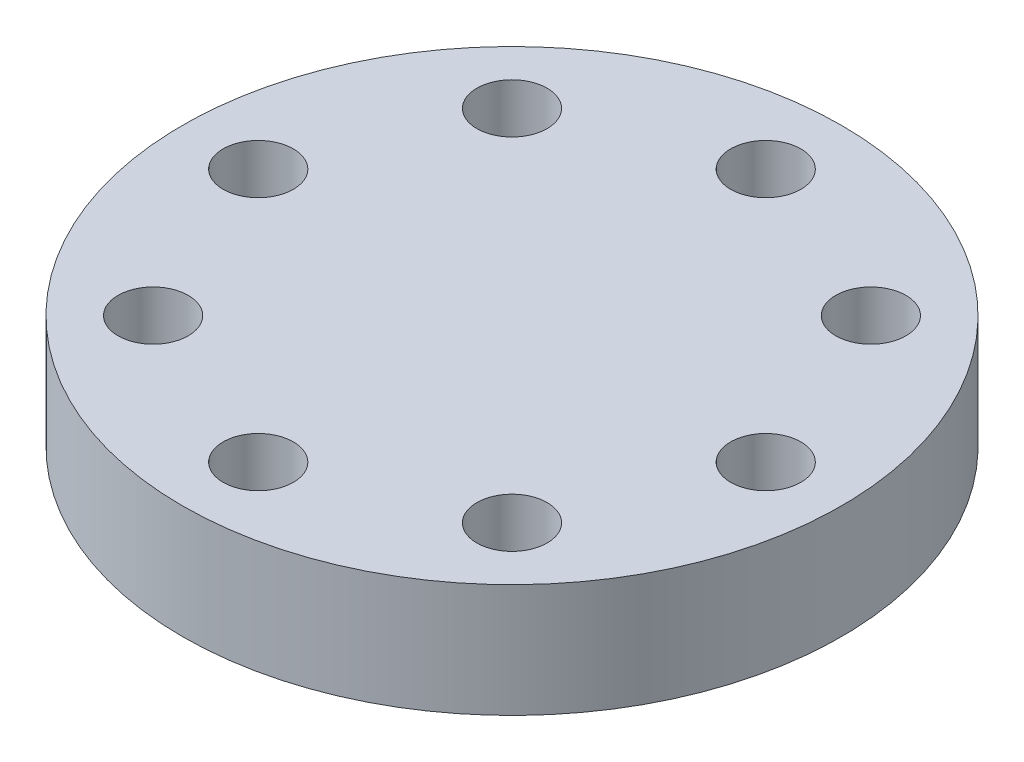
ISO-10303-21;
HEADER;
FILE_DESCRIPTION(('STEP AP214'),'2;1');
FILE_NAME('part.step','',(''),(''),'','','');
FILE_SCHEMA(('AUTOMOTIVE_DESIGN { 1 0 10303 214 1 1 1 1 }'));
ENDSEC;
DATA;
#1=APPLICATION_CONTEXT('core data for automotive mechanical design processes');
#2=APPLICATION_PROTOCOL_DEFINITION('international standard','automotive_design',2000,#1);
#3=PRODUCT_CONTEXT('',#1,'mechanical');
#4=PRODUCT('Part','Part','',(#3));
#5=PRODUCT_RELATED_PRODUCT_CATEGORY('part','',(#4));
#6=PRODUCT_DEFINITION_FORMATION('','',#4);
#7=PRODUCT_DEFINITION_CONTEXT('part definition',#1,'design');
#8=PRODUCT_DEFINITION('design','',#6,#7);
#9=PRODUCT_DEFINITION_SHAPE('','',#8);
#10=(LENGTH_UNIT() NAMED_UNIT(*) SI_UNIT(.MILLI.,.METRE.));
#11=(NAMED_UNIT(*) PLANE_ANGLE_UNIT() SI_UNIT($,.RADIAN.));
#12=(NAMED_UNIT(*) SI_UNIT($,.STERADIAN.) SOLID_ANGLE_UNIT());
#13=UNCERTAINTY_MEASURE_WITH_UNIT(LENGTH_MEASURE(1.E-05),#10,'distance_accuracy_value','');
#14=(GEOMETRIC_REPRESENTATION_CONTEXT(3) GLOBAL_UNCERTAINTY_ASSIGNED_CONTEXT((#13)) GLOBAL_UNIT_ASSIGNED_CONTEXT((#10,
#11,#12)) REPRESENTATION_CONTEXT('',''));
#15=CARTESIAN_POINT('',(0.,0.,0.));
#16=DIRECTION('',(0.,0.,1.));
#17=DIRECTION('',(1.,0.,0.));
#18=AXIS2_PLACEMENT_3D('',#15,#16,#17);
#19=CARTESIAN_POINT('',(0.,4.365625,0.));
#20=DIRECTION('',(0.,-1.,0.));
#21=DIRECTION('',(0.,0.,-1.));
#22=AXIS2_PLACEMENT_3D('',#19,#20,#21);
#23=CYLINDRICAL_SURFACE('',#22,12.7);
#24=CARTESIAN_POINT('',(0.,4.365625,0.));
#25=DIRECTION('',(0.,1.,0.));
#26=DIRECTION('',(0.,0.,1.));
#27=AXIS2_PLACEMENT_3D('',#24,#25,#26);
#28=CIRCLE('',#27,12.7);
#29=CARTESIAN_POINT('',(0.,4.365625,12.7));
#30=VERTEX_POINT('',#29);
#31=EDGE_CURVE('E10',#30,#30,#28,.T.);
#32=ORIENTED_EDGE('',*,*,#31,.F.);
#33=EDGE_LOOP('',(#32));
#34=FACE_BOUND('',#33,.T.);
#35=CARTESIAN_POINT('',(0.,0.,0.));
#36=DIRECTION('',(0.,1.,0.));
#37=DIRECTION('',(0.,0.,1.));
#38=AXIS2_PLACEMENT_3D('',#35,#36,#37);
#39=CIRCLE('',#38,12.7);
#40=CARTESIAN_POINT('',(0.,0.,12.7));
#41=VERTEX_POINT('',#40);
#42=EDGE_CURVE('E41',#41,#41,#39,.T.);
#43=ORIENTED_EDGE('',*,*,#42,.T.);
#44=EDGE_LOOP('',(#43));
#45=FACE_BOUND('',#44,.T.);
#46=ADVANCED_FACE('F34',(#34,#45),#23,.T.);
#47=CARTESIAN_POINT('',(0.,4.365625,0.));
#48=DIRECTION('',(0.,1.,0.));
#49=DIRECTION('',(0.,0.,1.));
#50=AXIS2_PLACEMENT_3D('',#47,#48,#49);
#51=PLANE('',#50);
#52=CARTESIAN_POINT('',(0.,4.365625,-9.779));
#53=DIRECTION('',(0.,1.,0.));
#54=DIRECTION('',(0.,0.,1.));
#55=AXIS2_PLACEMENT_3D('',#52,#53,#54);
#56=CIRCLE('',#55,1.35254999999999);
#57=CARTESIAN_POINT('',(0.,4.365625,-8.42645000000001));
#58=VERTEX_POINT('',#57);
#59=EDGE_CURVE('E85',#58,#58,#56,.T.);
#60=ORIENTED_EDGE('',*,*,#59,.F.);
#61=EDGE_LOOP('',(#60));
#62=FACE_BOUND('',#61,.T.);
#63=CARTESIAN_POINT('',(6.91479721322325,4.365625,-6.91479721322325));
#64=DIRECTION('',(0.,1.,0.));
#65=DIRECTION('',(0.,0.,1.));
#66=AXIS2_PLACEMENT_3D('',#63,#64,#65);
#67=CIRCLE('',#66,1.35254999999999);
#68=CARTESIAN_POINT('',(6.91479721322325,4.365625,-5.56224721322326));
#69=VERTEX_POINT('',#68);
#70=EDGE_CURVE('E75',#69,#69,#67,.T.);
#71=ORIENTED_EDGE('',*,*,#70,.F.);
#72=EDGE_LOOP('',(#71));
#73=FACE_BOUND('',#72,.T.);
#74=CARTESIAN_POINT('',(9.779,4.365625,0.));
#75=DIRECTION('',(0.,1.,0.));
#76=DIRECTION('',(0.,0.,1.));
#77=AXIS2_PLACEMENT_3D('',#74,#75,#76);
#78=CIRCLE('',#77,1.35254999999999);
#79=CARTESIAN_POINT('',(9.779,4.365625,1.35254999999999));
#80=VERTEX_POINT('',#79);
#81=EDGE_CURVE('E72',#80,#80,#78,.T.);
#82=ORIENTED_EDGE('',*,*,#81,.F.);
#83=EDGE_LOOP('',(#82));
#84=FACE_BOUND('',#83,.T.);
#85=CARTESIAN_POINT('',(6.91479721322325,4.365625,6.91479721322325));
#86=DIRECTION('',(0.,1.,0.));
#87=DIRECTION('',(0.,0.,1.));
#88=AXIS2_PLACEMENT_3D('',#85,#86,#87);
#89=CIRCLE('',#88,1.35254999999999);
#90=CARTESIAN_POINT('',(6.91479721322325,4.365625,8.26734721322324));
#91=VERTEX_POINT('',#90);
#92=EDGE_CURVE('E69',#91,#91,#89,.T.);
#93=ORIENTED_EDGE('',*,*,#92,.F.);
#94=EDGE_LOOP('',(#93));
#95=FACE_BOUND('',#94,.T.);
#96=CARTESIAN_POINT('',(0.,4.365625,9.779));
#97=DIRECTION('',(0.,1.,0.));
#98=DIRECTION('',(0.,0.,1.));
#99=AXIS2_PLACEMENT_3D('',#96,#97,#98);
#100=CIRCLE('',#99,1.35254999999999);
#101=CARTESIAN_POINT('',(0.,4.365625,11.13155));
#102=VERTEX_POINT('',#101);
#103=EDGE_CURVE('E65',#102,#102,#100,.T.);
#104=ORIENTED_EDGE('',*,*,#103,.F.);
#105=EDGE_LOOP('',(#104));
#106=FACE_BOUND('',#105,.T.);
#107=CARTESIAN_POINT('',(-6.91479721322325,4.365625,6.91479721322325));
#108=DIRECTION('',(0.,1.,0.));
#109=DIRECTION('',(0.,0.,1.));
#110=AXIS2_PLACEMENT_3D('',#107,#108,#109);
#111=CIRCLE('',#110,1.35254999999999);
#112=CARTESIAN_POINT('',(-6.91479721322325,4.365625,8.26734721322324));
#113=VERTEX_POINT('',#112);
#114=EDGE_CURVE('E61',#113,#113,#111,.T.);
#115=ORIENTED_EDGE('',*,*,#114,.F.);
#116=EDGE_LOOP('',(#115));
#117=FACE_BOUND('',#116,.T.);
#118=CARTESIAN_POINT('',(-9.779,4.365625,0.));
#119=DIRECTION('',(0.,1.,0.));
#120=DIRECTION('',(0.,0.,1.));
#121=AXIS2_PLACEMENT_3D('',#118,#119,#120);
#122=CIRCLE('',#121,1.35254999999999);
#123=CARTESIAN_POINT('',(-9.779,4.365625,1.35254999999999));
#124=VERTEX_POINT('',#123);
#125=EDGE_CURVE('E57',#124,#124,#122,.T.);
#126=ORIENTED_EDGE('',*,*,#125,.F.);
#127=EDGE_LOOP('',(#126));
#128=FACE_BOUND('',#127,.T.);
#129=CARTESIAN_POINT('',(-6.91479721322325,4.365625,-6.91479721322325));
#130=DIRECTION('',(0.,1.,0.));
#131=DIRECTION('',(0.,0.,1.));
#132=AXIS2_PLACEMENT_3D('',#129,#130,#131);
#133=CIRCLE('',#132,1.35254999999999);
#134=CARTESIAN_POINT('',(-6.91479721322325,4.365625,-5.56224721322326));
#135=VERTEX_POINT('',#134);
#136=EDGE_CURVE('E49',#135,#135,#133,.T.);
#137=ORIENTED_EDGE('',*,*,#136,.F.);
#138=EDGE_LOOP('',(#137));
#139=FACE_BOUND('',#138,.T.);
#140=ORIENTED_EDGE('',*,*,#31,.T.);
#141=EDGE_LOOP('',(#140));
#142=FACE_BOUND('',#141,.T.);
#143=ADVANCED_FACE('F99',(#62,#73,#84,#95,#106,#117,#128,#139,#142),#51,.T.);
#144=CARTESIAN_POINT('',(0.,0.,0.));
#145=DIRECTION('',(0.,1.,0.));
#146=DIRECTION('',(0.,0.,1.));
#147=AXIS2_PLACEMENT_3D('',#144,#145,#146);
#148=PLANE('',#147);
#149=CARTESIAN_POINT('',(0.,0.,-9.779));
#150=DIRECTION('',(0.,1.,0.));
#151=DIRECTION('',(0.,0.,1.));
#152=AXIS2_PLACEMENT_3D('',#149,#150,#151);
#153=CIRCLE('',#152,1.35254999999999);
#154=CARTESIAN_POINT('',(0.,0.,-8.42645000000001));
#155=VERTEX_POINT('',#154);
#156=EDGE_CURVE('E37',#155,#155,#153,.T.);
#157=ORIENTED_EDGE('',*,*,#156,.T.);
#158=EDGE_LOOP('',(#157));
#159=FACE_BOUND('',#158,.T.);
#160=CARTESIAN_POINT('',(6.91479721322325,0.,-6.91479721322325));
#161=DIRECTION('',(0.,1.,0.));
#162=DIRECTION('',(0.,0.,1.));
#163=AXIS2_PLACEMENT_3D('',#160,#161,#162);
#164=CIRCLE('',#163,1.35254999999999);
#165=CARTESIAN_POINT('',(6.91479721322325,0.,-5.56224721322326));
#166=VERTEX_POINT('',#165);
#167=EDGE_CURVE('E73',#166,#166,#164,.T.);
#168=ORIENTED_EDGE('',*,*,#167,.T.);
#169=EDGE_LOOP('',(#168));
#170=FACE_BOUND('',#169,.T.);
#171=CARTESIAN_POINT('',(9.779,0.,0.));
#172=DIRECTION('',(0.,1.,0.));
#173=DIRECTION('',(0.,0.,1.));
#174=AXIS2_PLACEMENT_3D('',#171,#172,#173);
#175=CIRCLE('',#174,1.35254999999999);
#176=CARTESIAN_POINT('',(9.779,0.,1.35254999999999));
#177=VERTEX_POINT('',#176);
#178=EDGE_CURVE('E70',#177,#177,#175,.T.);
#179=ORIENTED_EDGE('',*,*,#178,.T.);
#180=EDGE_LOOP('',(#179));
#181=FACE_BOUND('',#180,.T.);
#182=CARTESIAN_POINT('',(6.91479721322325,0.,6.91479721322325));
#183=DIRECTION('',(0.,1.,0.));
#184=DIRECTION('',(0.,0.,1.));
#185=AXIS2_PLACEMENT_3D('',#182,#183,#184);
#186=CIRCLE('',#185,1.35254999999999);
#187=CARTESIAN_POINT('',(6.91479721322325,0.,8.26734721322324));
#188=VERTEX_POINT('',#187);
#189=EDGE_CURVE('E66',#188,#188,#186,.T.);
#190=ORIENTED_EDGE('',*,*,#189,.T.);
#191=EDGE_LOOP('',(#190));
#192=FACE_BOUND('',#191,.T.);
#193=CARTESIAN_POINT('',(0.,0.,9.779));
#194=DIRECTION('',(0.,1.,0.));
#195=DIRECTION('',(0.,0.,1.));
#196=AXIS2_PLACEMENT_3D('',#193,#194,#195);
#197=CIRCLE('',#196,1.35254999999999);
#198=CARTESIAN_POINT('',(0.,0.,11.13155));
#199=VERTEX_POINT('',#198);
#200=EDGE_CURVE('E62',#199,#199,#197,.T.);
#201=ORIENTED_EDGE('',*,*,#200,.T.);
#202=EDGE_LOOP('',(#201));
#203=FACE_BOUND('',#202,.T.);
#204=CARTESIAN_POINT('',(-6.91479721322325,0.,6.91479721322325));
#205=DIRECTION('',(0.,1.,0.));
#206=DIRECTION('',(0.,0.,1.));
#207=AXIS2_PLACEMENT_3D('',#204,#205,#206);
#208=CIRCLE('',#207,1.35254999999999);
#209=CARTESIAN_POINT('',(-6.91479721322325,0.,8.26734721322324));
#210=VERTEX_POINT('',#209);
#211=EDGE_CURVE('E58',#210,#210,#208,.T.);
#212=ORIENTED_EDGE('',*,*,#211,.T.);
#213=EDGE_LOOP('',(#212));
#214=FACE_BOUND('',#213,.T.);
#215=CARTESIAN_POINT('',(-9.779,0.,0.));
#216=DIRECTION('',(0.,1.,0.));
#217=DIRECTION('',(0.,0.,1.));
#218=AXIS2_PLACEMENT_3D('',#215,#216,#217);
#219=CIRCLE('',#218,1.35254999999999);
#220=CARTESIAN_POINT('',(-9.779,0.,1.35254999999999));
#221=VERTEX_POINT('',#220);
#222=EDGE_CURVE('E54',#221,#221,#219,.T.);
#223=ORIENTED_EDGE('',*,*,#222,.T.);
#224=EDGE_LOOP('',(#223));
#225=FACE_BOUND('',#224,.T.);
#226=CARTESIAN_POINT('',(-6.91479721322325,0.,-6.91479721322325));
#227=DIRECTION('',(0.,1.,0.));
#228=DIRECTION('',(0.,0.,1.));
#229=AXIS2_PLACEMENT_3D('',#226,#227,#228);
#230=CIRCLE('',#229,1.35254999999999);
#231=CARTESIAN_POINT('',(-6.91479721322325,0.,-5.56224721322326));
#232=VERTEX_POINT('',#231);
#233=EDGE_CURVE('E46',#232,#232,#230,.T.);
#234=ORIENTED_EDGE('',*,*,#233,.T.);
#235=EDGE_LOOP('',(#234));
#236=FACE_BOUND('',#235,.T.);
#237=ORIENTED_EDGE('',*,*,#42,.F.);
#238=EDGE_LOOP('',(#237));
#239=FACE_BOUND('',#238,.T.);
#240=ADVANCED_FACE('F102',(#159,#170,#181,#192,#203,#214,#225,#236,#239),#148,.F.);
#241=CARTESIAN_POINT('',(-6.91479721322325,4.365625,-6.91479721322325));
#242=DIRECTION('',(0.,1.,0.));
#243=DIRECTION('',(0.,0.,1.));
#244=AXIS2_PLACEMENT_3D('',#241,#242,#243);
#245=CYLINDRICAL_SURFACE('',#244,1.35254999999999);
#246=ORIENTED_EDGE('',*,*,#136,.T.);
#247=EDGE_LOOP('',(#246));
#248=FACE_BOUND('',#247,.T.);
#249=ORIENTED_EDGE('',*,*,#233,.F.);
#250=EDGE_LOOP('',(#249));
#251=FACE_BOUND('',#250,.T.);
#252=ADVANCED_FACE('F108',(#248,#251),#245,.F.);
#253=CARTESIAN_POINT('',(-9.779,4.365625,0.));
#254=DIRECTION('',(0.,1.,0.));
#255=DIRECTION('',(0.,0.,1.));
#256=AXIS2_PLACEMENT_3D('',#253,#254,#255);
#257=CYLINDRICAL_SURFACE('',#256,1.35254999999999);
#258=ORIENTED_EDGE('',*,*,#125,.T.);
#259=EDGE_LOOP('',(#258));
#260=FACE_BOUND('',#259,.T.);
#261=ORIENTED_EDGE('',*,*,#222,.F.);
#262=EDGE_LOOP('',(#261));
#263=FACE_BOUND('',#262,.T.);
#264=ADVANCED_FACE('F96',(#260,#263),#257,.F.);
#265=CARTESIAN_POINT('',(-6.91479721322325,4.365625,6.91479721322325));
#266=DIRECTION('',(0.,1.,0.));
#267=DIRECTION('',(0.,0.,1.));
#268=AXIS2_PLACEMENT_3D('',#265,#266,#267);
#269=CYLINDRICAL_SURFACE('',#268,1.35254999999999);
#270=ORIENTED_EDGE('',*,*,#114,.T.);
#271=EDGE_LOOP('',(#270));
#272=FACE_BOUND('',#271,.T.);
#273=ORIENTED_EDGE('',*,*,#211,.F.);
#274=EDGE_LOOP('',(#273));
#275=FACE_BOUND('',#274,.T.);
#276=ADVANCED_FACE('F141',(#272,#275),#269,.F.);
#277=CARTESIAN_POINT('',(0.,4.365625,9.779));
#278=DIRECTION('',(0.,1.,0.));
#279=DIRECTION('',(0.,0.,1.));
#280=AXIS2_PLACEMENT_3D('',#277,#278,#279);
#281=CYLINDRICAL_SURFACE('',#280,1.35254999999999);
#282=ORIENTED_EDGE('',*,*,#103,.T.);
#283=EDGE_LOOP('',(#282));
#284=FACE_BOUND('',#283,.T.);
#285=ORIENTED_EDGE('',*,*,#200,.F.);
#286=EDGE_LOOP('',(#285));
#287=FACE_BOUND('',#286,.T.);
#288=ADVANCED_FACE('F148',(#284,#287),#281,.F.);
#289=CARTESIAN_POINT('',(6.91479721322325,4.365625,6.91479721322325));
#290=DIRECTION('',(0.,1.,0.));
#291=DIRECTION('',(0.,0.,1.));
#292=AXIS2_PLACEMENT_3D('',#289,#290,#291);
#293=CYLINDRICAL_SURFACE('',#292,1.35254999999999);
#294=ORIENTED_EDGE('',*,*,#92,.T.);
#295=EDGE_LOOP('',(#294));
#296=FACE_BOUND('',#295,.T.);
#297=ORIENTED_EDGE('',*,*,#189,.F.);
#298=EDGE_LOOP('',(#297));
#299=FACE_BOUND('',#298,.T.);
#300=ADVANCED_FACE('F156',(#296,#299),#293,.F.);
#301=CARTESIAN_POINT('',(9.779,4.365625,0.));
#302=DIRECTION('',(0.,1.,0.));
#303=DIRECTION('',(0.,0.,1.));
#304=AXIS2_PLACEMENT_3D('',#301,#302,#303);
#305=CYLINDRICAL_SURFACE('',#304,1.35254999999999);
#306=ORIENTED_EDGE('',*,*,#81,.T.);
#307=EDGE_LOOP('',(#306));
#308=FACE_BOUND('',#307,.T.);
#309=ORIENTED_EDGE('',*,*,#178,.F.);
#310=EDGE_LOOP('',(#309));
#311=FACE_BOUND('',#310,.T.);
#312=ADVANCED_FACE('F164',(#308,#311),#305,.F.);
#313=CARTESIAN_POINT('',(6.91479721322325,4.365625,-6.91479721322325));
#314=DIRECTION('',(0.,1.,0.));
#315=DIRECTION('',(0.,0.,1.));
#316=AXIS2_PLACEMENT_3D('',#313,#314,#315);
#317=CYLINDRICAL_SURFACE('',#316,1.35254999999999);
#318=ORIENTED_EDGE('',*,*,#70,.T.);
#319=EDGE_LOOP('',(#318));
#320=FACE_BOUND('',#319,.T.);
#321=ORIENTED_EDGE('',*,*,#167,.F.);
#322=EDGE_LOOP('',(#321));
#323=FACE_BOUND('',#322,.T.);
#324=ADVANCED_FACE('F172',(#320,#323),#317,.F.);
#325=CARTESIAN_POINT('',(0.,4.365625,-9.779));
#326=DIRECTION('',(0.,1.,0.));
#327=DIRECTION('',(0.,0.,1.));
#328=AXIS2_PLACEMENT_3D('',#325,#326,#327);
#329=CYLINDRICAL_SURFACE('',#328,1.35254999999999);
#330=ORIENTED_EDGE('',*,*,#59,.T.);
#331=EDGE_LOOP('',(#330));
#332=FACE_BOUND('',#331,.T.);
#333=ORIENTED_EDGE('',*,*,#156,.F.);
#334=EDGE_LOOP('',(#333));
#335=FACE_BOUND('',#334,.T.);
#336=ADVANCED_FACE('F180',(#332,#335),#329,.F.);
#337=CLOSED_SHELL('',(#46,#143,#240,#252,#264,#276,#288,#300,#312,#324,#336));
#338=MANIFOLD_SOLID_BREP('B2',#337);
#339=ADVANCED_BREP_SHAPE_REPRESENTATION('',(#18,#338),#14);
#340=SHAPE_DEFINITION_REPRESENTATION(#9,#339);
ENDSEC;
END-ISO-10303-21;
